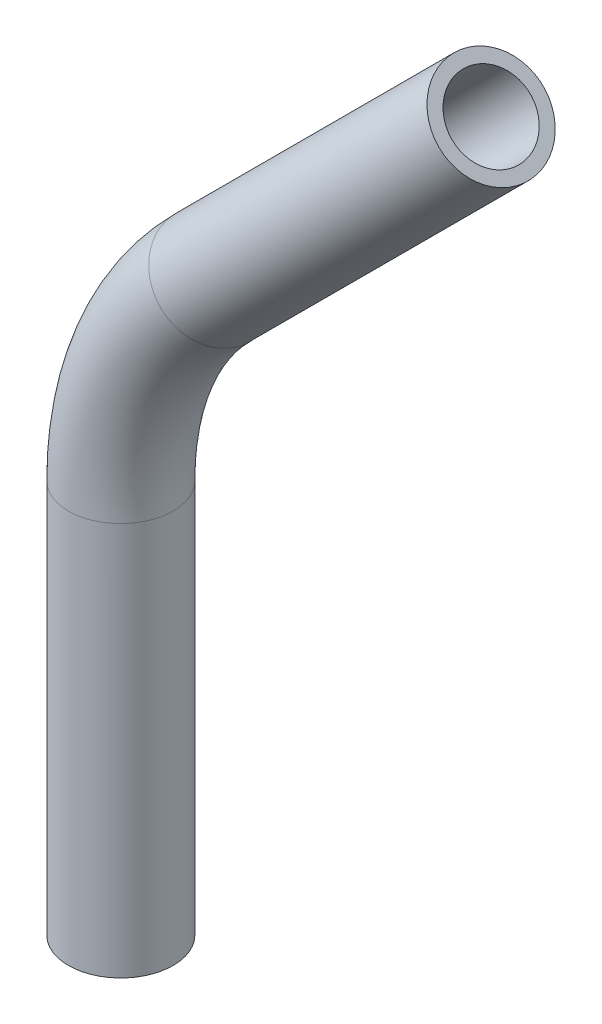
ISO-10303-21;
HEADER;
FILE_DESCRIPTION(('STEP AP214'),'2;1');
FILE_NAME('part.step','',(''),(''),'','','');
FILE_SCHEMA(('AUTOMOTIVE_DESIGN { 1 0 10303 214 1 1 1 1 }'));
ENDSEC;
DATA;
#1=APPLICATION_CONTEXT('core data for automotive mechanical design processes');
#2=APPLICATION_PROTOCOL_DEFINITION('international standard','automotive_design',2000,#1);
#3=PRODUCT_CONTEXT('',#1,'mechanical');
#4=PRODUCT('Part','Part','',(#3));
#5=PRODUCT_RELATED_PRODUCT_CATEGORY('part','',(#4));
#6=PRODUCT_DEFINITION_FORMATION('','',#4);
#7=PRODUCT_DEFINITION_CONTEXT('part definition',#1,'design');
#8=PRODUCT_DEFINITION('design','',#6,#7);
#9=PRODUCT_DEFINITION_SHAPE('','',#8);
#10=(LENGTH_UNIT() NAMED_UNIT(*) SI_UNIT(.MILLI.,.METRE.));
#11=(NAMED_UNIT(*) PLANE_ANGLE_UNIT() SI_UNIT($,.RADIAN.));
#12=(NAMED_UNIT(*) SI_UNIT($,.STERADIAN.) SOLID_ANGLE_UNIT());
#13=UNCERTAINTY_MEASURE_WITH_UNIT(LENGTH_MEASURE(1.E-05),#10,'distance_accuracy_value','');
#14=(GEOMETRIC_REPRESENTATION_CONTEXT(3) GLOBAL_UNCERTAINTY_ASSIGNED_CONTEXT((#13)) GLOBAL_UNIT_ASSIGNED_CONTEXT((#10,
#11,#12)) REPRESENTATION_CONTEXT('',''));
#15=CARTESIAN_POINT('',(0.,0.,0.));
#16=DIRECTION('',(0.,0.,1.));
#17=DIRECTION('',(1.,0.,0.));
#18=AXIS2_PLACEMENT_3D('',#15,#16,#17);
#19=CARTESIAN_POINT('',(0.,0.,0.));
#20=DIRECTION('',(0.,1.,0.));
#21=DIRECTION('',(0.,0.,1.));
#22=AXIS2_PLACEMENT_3D('',#19,#20,#21);
#23=CYLINDRICAL_SURFACE('',#22,4.);
#24=CARTESIAN_POINT('',(0.,30.0588745030457,0.));
#25=DIRECTION('',(0.,1.,0.));
#26=DIRECTION('',(0.,0.,1.));
#27=AXIS2_PLACEMENT_3D('',#24,#25,#26);
#28=CIRCLE('',#27,4.);
#29=CARTESIAN_POINT('',(-4.,30.0588745030457,0.));
#30=VERTEX_POINT('',#29);
#31=EDGE_CURVE('E81',#30,#30,#28,.T.);
#32=ORIENTED_EDGE('',*,*,#31,.F.);
#33=EDGE_LOOP('',(#32));
#34=FACE_BOUND('',#33,.T.);
#35=CARTESIAN_POINT('',(0.,0.,0.));
#36=DIRECTION('',(0.,1.,0.));
#37=DIRECTION('',(0.,0.,1.));
#38=AXIS2_PLACEMENT_3D('',#35,#36,#37);
#39=CIRCLE('',#38,4.);
#40=CARTESIAN_POINT('',(0.,0.,4.));
#41=VERTEX_POINT('',#40);
#42=EDGE_CURVE('E50',#41,#41,#39,.T.);
#43=ORIENTED_EDGE('',*,*,#42,.T.);
#44=EDGE_LOOP('',(#43));
#45=FACE_BOUND('',#44,.T.);
#46=ADVANCED_FACE('F35',(#34,#45),#23,.T.);
#47=CARTESIAN_POINT('',(24.,30.0588745030457,0.));
#48=DIRECTION('',(0.,0.,-1.));
#49=DIRECTION('',(-1.,0.,0.));
#50=AXIS2_PLACEMENT_3D('',#47,#48,#49);
#51=TOROIDAL_SURFACE('',#50,24.,4.);
#52=CARTESIAN_POINT('',(7.02943725152289,47.0294372515229,0.));
#53=DIRECTION('',(0.707106781186549,0.707106781186546,0.));
#54=DIRECTION('',(0.,0.,1.));
#55=AXIS2_PLACEMENT_3D('',#52,#53,#54);
#56=CIRCLE('',#55,4.);
#57=CARTESIAN_POINT('',(4.20101012677671,49.8578643762691,0.));
#58=VERTEX_POINT('',#57);
#59=EDGE_CURVE('E39',#58,#58,#56,.T.);
#60=CARTESIAN_POINT('',(24.,30.0588745030457,0.));
#61=DIRECTION('',(0.,0.,-1.));
#62=DIRECTION('',(-1.,0.,0.));
#63=AXIS2_PLACEMENT_3D('',#60,#61,#62);
#64=CIRCLE('',#63,28.);
#65=EDGE_CURVE('',#30,#58,#64,.T.);
#66=ORIENTED_EDGE('',*,*,#31,.T.);
#67=ORIENTED_EDGE('',*,*,#59,.F.);
#68=ORIENTED_EDGE('',*,*,#65,.T.);
#69=ORIENTED_EDGE('',*,*,#65,.F.);
#70=EDGE_LOOP('',(#66,#68,#67,#69));
#71=FACE_BOUND('',#70,.T.);
#72=ADVANCED_FACE('F89',(#71),#51,.T.);
#73=CARTESIAN_POINT('',(7.02943725152289,47.0294372515229,0.));
#74=DIRECTION('',(0.707106781186549,0.707106781186546,0.));
#75=DIRECTION('',(-0.707106781186546,0.707106781186549,0.));
#76=AXIS2_PLACEMENT_3D('',#73,#74,#75);
#77=CYLINDRICAL_SURFACE('',#76,4.);
#78=CARTESIAN_POINT('',(28.284271247462,68.2842712474618,0.));
#79=DIRECTION('',(0.707106781186549,0.707106781186546,0.));
#80=DIRECTION('',(0.,0.,1.));
#81=AXIS2_PLACEMENT_3D('',#78,#79,#80);
#82=CIRCLE('',#81,4.);
#83=CARTESIAN_POINT('',(28.284271247462,68.2842712474618,4.));
#84=VERTEX_POINT('',#83);
#85=EDGE_CURVE('E55',#84,#84,#82,.T.);
#86=ORIENTED_EDGE('',*,*,#85,.F.);
#87=EDGE_LOOP('',(#86));
#88=FACE_BOUND('',#87,.T.);
#89=ORIENTED_EDGE('',*,*,#59,.T.);
#90=EDGE_LOOP('',(#89));
#91=FACE_BOUND('',#90,.T.);
#92=ADVANCED_FACE('F37',(#88,#91),#77,.T.);
#93=CARTESIAN_POINT('',(0.,0.,0.));
#94=DIRECTION('',(0.,1.,0.));
#95=DIRECTION('',(0.,0.,1.));
#96=AXIS2_PLACEMENT_3D('',#93,#94,#95);
#97=PLANE('',#96);
#98=CARTESIAN_POINT('',(0.,0.,0.));
#99=DIRECTION('',(0.,1.,0.));
#100=DIRECTION('',(0.,0.,1.));
#101=AXIS2_PLACEMENT_3D('',#98,#99,#100);
#102=CIRCLE('',#101,3.);
#103=CARTESIAN_POINT('',(0.,0.,3.));
#104=VERTEX_POINT('',#103);
#105=EDGE_CURVE('E76',#104,#104,#102,.F.);
#106=ORIENTED_EDGE('',*,*,#105,.F.);
#107=EDGE_LOOP('',(#106));
#108=FACE_BOUND('',#107,.T.);
#109=ORIENTED_EDGE('',*,*,#42,.F.);
#110=EDGE_LOOP('',(#109));
#111=FACE_BOUND('',#110,.T.);
#112=ADVANCED_FACE('F95',(#108,#111),#97,.F.);
#113=CARTESIAN_POINT('',(28.284271247462,68.2842712474618,0.));
#114=DIRECTION('',(0.707106781186549,0.707106781186546,0.));
#115=DIRECTION('',(0.,0.,1.));
#116=AXIS2_PLACEMENT_3D('',#113,#114,#115);
#117=PLANE('',#116);
#118=CARTESIAN_POINT('',(28.284271247462,68.2842712474618,0.));
#119=DIRECTION('',(0.707106781186549,0.707106781186546,0.));
#120=DIRECTION('',(0.,0.,1.));
#121=AXIS2_PLACEMENT_3D('',#118,#119,#120);
#122=CIRCLE('',#121,3.);
#123=CARTESIAN_POINT('',(28.284271247462,68.2842712474618,3.));
#124=VERTEX_POINT('',#123);
#125=EDGE_CURVE('E11',#124,#124,#122,.F.);
#126=ORIENTED_EDGE('',*,*,#125,.T.);
#127=EDGE_LOOP('',(#126));
#128=FACE_BOUND('',#127,.T.);
#129=ORIENTED_EDGE('',*,*,#85,.T.);
#130=EDGE_LOOP('',(#129));
#131=FACE_BOUND('',#130,.T.);
#132=ADVANCED_FACE('F62',(#128,#131),#117,.T.);
#133=CARTESIAN_POINT('',(0.,0.,0.));
#134=DIRECTION('',(0.,1.,0.));
#135=DIRECTION('',(0.,0.,1.));
#136=AXIS2_PLACEMENT_3D('',#133,#134,#135);
#137=CYLINDRICAL_SURFACE('',#136,3.);
#138=CARTESIAN_POINT('',(0.,30.0588745030457,0.));
#139=DIRECTION('',(0.,1.,0.));
#140=DIRECTION('',(0.,0.,1.));
#141=AXIS2_PLACEMENT_3D('',#138,#139,#140);
#142=CIRCLE('',#141,3.);
#143=CARTESIAN_POINT('',(-3.,30.0588745030457,0.));
#144=VERTEX_POINT('',#143);
#145=EDGE_CURVE('E73',#144,#144,#142,.F.);
#146=ORIENTED_EDGE('',*,*,#145,.F.);
#147=EDGE_LOOP('',(#146));
#148=FACE_BOUND('',#147,.T.);
#149=ORIENTED_EDGE('',*,*,#105,.T.);
#150=EDGE_LOOP('',(#149));
#151=FACE_BOUND('',#150,.T.);
#152=ADVANCED_FACE('F103',(#148,#151),#137,.F.);
#153=CARTESIAN_POINT('',(24.,30.0588745030457,0.));
#154=DIRECTION('',(0.,0.,-1.));
#155=DIRECTION('',(-1.,0.,0.));
#156=AXIS2_PLACEMENT_3D('',#153,#154,#155);
#157=TOROIDAL_SURFACE('',#156,24.,3.);
#158=CARTESIAN_POINT('',(7.02943725152289,47.0294372515229,0.));
#159=DIRECTION('',(0.707106781186549,0.707106781186546,0.));
#160=DIRECTION('',(0.,0.,1.));
#161=AXIS2_PLACEMENT_3D('',#158,#159,#160);
#162=CIRCLE('',#161,3.);
#163=CARTESIAN_POINT('',(4.90811690796325,49.1507575950825,0.));
#164=VERTEX_POINT('',#163);
#165=EDGE_CURVE('E44',#164,#164,#162,.F.);
#166=CARTESIAN_POINT('',(24.,30.0588745030457,0.));
#167=DIRECTION('',(0.,0.,-1.));
#168=DIRECTION('',(-1.,0.,0.));
#169=AXIS2_PLACEMENT_3D('',#166,#167,#168);
#170=CIRCLE('',#169,27.);
#171=EDGE_CURVE('',#144,#164,#170,.T.);
#172=ORIENTED_EDGE('',*,*,#145,.T.);
#173=ORIENTED_EDGE('',*,*,#165,.F.);
#174=ORIENTED_EDGE('',*,*,#171,.T.);
#175=ORIENTED_EDGE('',*,*,#171,.F.);
#176=EDGE_LOOP('',(#172,#174,#173,#175));
#177=FACE_BOUND('',#176,.T.);
#178=ADVANCED_FACE('F68',(#177),#157,.F.);
#179=CARTESIAN_POINT('',(7.02943725152289,47.0294372515229,0.));
#180=DIRECTION('',(0.707106781186549,0.707106781186546,0.));
#181=DIRECTION('',(-0.707106781186546,0.707106781186549,0.));
#182=AXIS2_PLACEMENT_3D('',#179,#180,#181);
#183=CYLINDRICAL_SURFACE('',#182,3.);
#184=ORIENTED_EDGE('',*,*,#125,.F.);
#185=EDGE_LOOP('',(#184));
#186=FACE_BOUND('',#185,.T.);
#187=ORIENTED_EDGE('',*,*,#165,.T.);
#188=EDGE_LOOP('',(#187));
#189=FACE_BOUND('',#188,.T.);
#190=ADVANCED_FACE('F65',(#186,#189),#183,.F.);
#191=CLOSED_SHELL('',(#46,#72,#92,#112,#132,#152,#178,#190));
#192=MANIFOLD_SOLID_BREP('B2',#191);
#193=ADVANCED_BREP_SHAPE_REPRESENTATION('',(#18,#192),#14);
#194=SHAPE_DEFINITION_REPRESENTATION(#9,#193);
ENDSEC;
END-ISO-10303-21;
